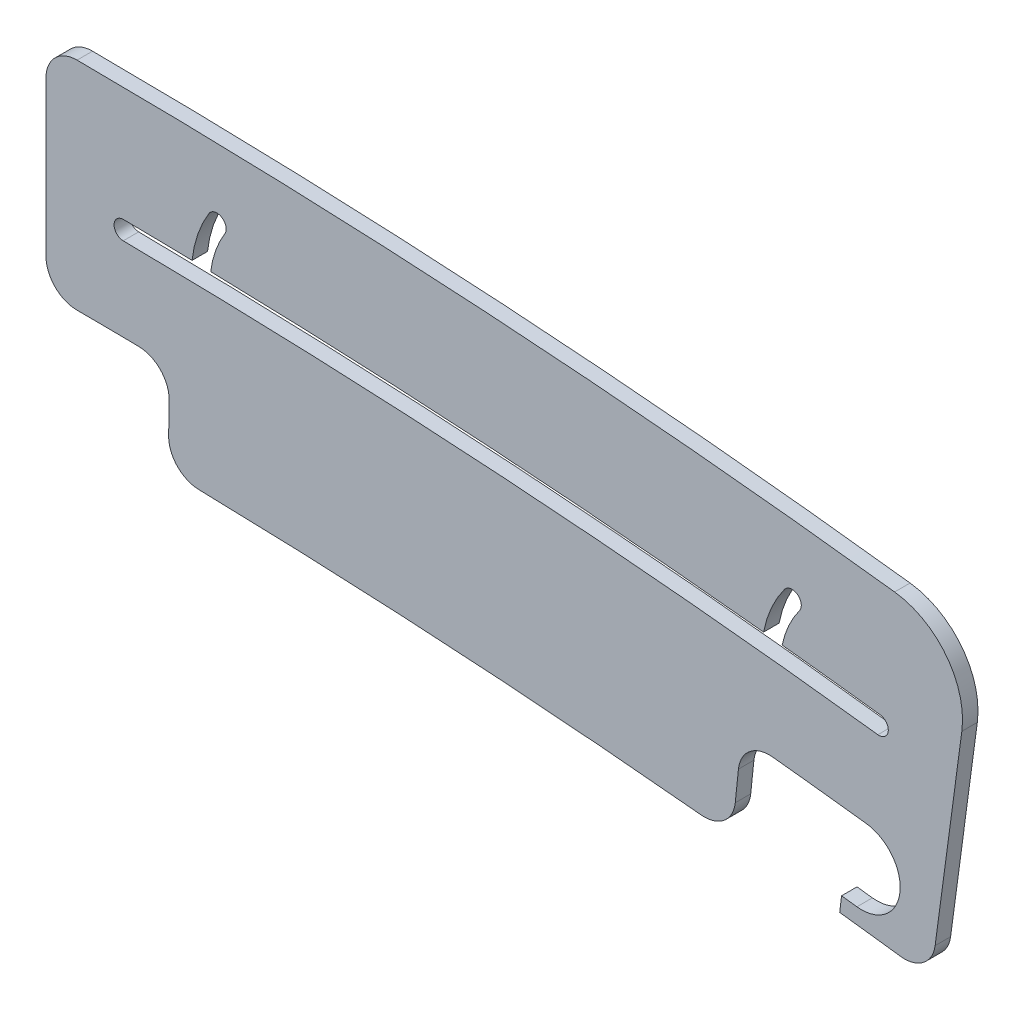
ISO-10303-21;
HEADER;
FILE_DESCRIPTION(('STEP AP214'),'2;1');
FILE_NAME('part.step','',(''),(''),'','','');
FILE_SCHEMA(('AUTOMOTIVE_DESIGN { 1 0 10303 214 1 1 1 1 }'));
ENDSEC;
DATA;
#1=APPLICATION_CONTEXT('core data for automotive mechanical design processes');
#2=APPLICATION_PROTOCOL_DEFINITION('international standard','automotive_design',2000,#1);
#3=PRODUCT_CONTEXT('',#1,'mechanical');
#4=PRODUCT('Part','Part','',(#3));
#5=PRODUCT_RELATED_PRODUCT_CATEGORY('part','',(#4));
#6=PRODUCT_DEFINITION_FORMATION('','',#4);
#7=PRODUCT_DEFINITION_CONTEXT('part definition',#1,'design');
#8=PRODUCT_DEFINITION('design','',#6,#7);
#9=PRODUCT_DEFINITION_SHAPE('','',#8);
#10=(LENGTH_UNIT() NAMED_UNIT(*) SI_UNIT(.MILLI.,.METRE.));
#11=(NAMED_UNIT(*) PLANE_ANGLE_UNIT() SI_UNIT($,.RADIAN.));
#12=(NAMED_UNIT(*) SI_UNIT($,.STERADIAN.) SOLID_ANGLE_UNIT());
#13=UNCERTAINTY_MEASURE_WITH_UNIT(LENGTH_MEASURE(1.E-05),#10,'distance_accuracy_value','');
#14=(GEOMETRIC_REPRESENTATION_CONTEXT(3) GLOBAL_UNCERTAINTY_ASSIGNED_CONTEXT((#13)) GLOBAL_UNIT_ASSIGNED_CONTEXT((#10,
#11,#12)) REPRESENTATION_CONTEXT('',''));
#15=CARTESIAN_POINT('',(0.,0.,0.));
#16=DIRECTION('',(0.,0.,1.));
#17=DIRECTION('',(1.,0.,0.));
#18=AXIS2_PLACEMENT_3D('',#15,#16,#17);
#19=CARTESIAN_POINT('',(0.,-450.,1.));
#20=DIRECTION('',(0.,0.,-1.));
#21=DIRECTION('',(-1.,0.,0.));
#22=AXIS2_PLACEMENT_3D('',#19,#20,#21);
#23=PLANE('',#22);
#24=DIRECTION('',(0.133036707085296,0.991111111111111,0.));
#25=VECTOR('',#24,1.);
#26=CARTESIAN_POINT('',(59.8665181883831,-4.,1.));
#27=LINE('',#26,#25);
#28=CARTESIAN_POINT('',(57.4712415468665,-21.8445885019532,1.));
#29=VERTEX_POINT('',#28);
#30=CARTESIAN_POINT('',(59.1975975488495,-8.98339663404445,1.));
#31=VERTEX_POINT('',#30);
#32=EDGE_CURVE('E371',#29,#31,#27,.T.);
#33=ORIENTED_EDGE('',*,*,#32,.T.);
#34=CARTESIAN_POINT('',(54.242041993294,-8.31821309861797,1.));
#35=DIRECTION('',(0.,0.,-1.));
#36=DIRECTION('',(-1.,0.,0.));
#37=AXIS2_PLACEMENT_3D('',#34,#35,#36);
#38=CIRCLE('',#37,5.);
#39=CARTESIAN_POINT('',(54.851503139286,-3.355496391861,1.));
#40=VERTEX_POINT('',#39);
#41=EDGE_CURVE('E438',#31,#40,#38,.F.);
#42=ORIENTED_EDGE('',*,*,#41,.T.);
#43=CARTESIAN_POINT('',(0.,-450.,1.));
#44=DIRECTION('',(0.,0.,1.));
#45=DIRECTION('',(-1.,0.,0.));
#46=AXIS2_PLACEMENT_3D('',#43,#44,#45);
#47=CIRCLE('',#46,450.);
#48=CARTESIAN_POINT('',(2.00892857142857,-0.00448423790389008,1.));
#49=VERTEX_POINT('',#48);
#50=EDGE_CURVE('E360',#40,#49,#47,.T.);
#51=ORIENTED_EDGE('',*,*,#50,.T.);
#52=CARTESIAN_POINT('',(2.,-2.00446430795764,1.));
#53=DIRECTION('',(0.,0.,-1.));
#54=DIRECTION('',(-1.,0.,0.));
#55=AXIS2_PLACEMENT_3D('',#52,#53,#54);
#56=CIRCLE('',#55,2.);
#57=CARTESIAN_POINT('',(0.,-2.00446430795764,1.));
#58=VERTEX_POINT('',#57);
#59=EDGE_CURVE('E428',#49,#58,#56,.F.);
#60=ORIENTED_EDGE('',*,*,#59,.T.);
#61=DIRECTION('',(0.,-1.,0.));
#62=VECTOR('',#61,1.);
#63=CARTESIAN_POINT('',(0.,0.,1.));
#64=LINE('',#63,#62);
#65=CARTESIAN_POINT('',(0.,-12.0045662338476,1.));
#66=VERTEX_POINT('',#65);
#67=EDGE_CURVE('E363',#58,#66,#64,.T.);
#68=ORIENTED_EDGE('',*,*,#67,.T.);
#69=CARTESIAN_POINT('',(2.,-12.0045662338476,1.));
#70=DIRECTION('',(0.,0.,-1.));
#71=DIRECTION('',(-1.,0.,0.));
#72=AXIS2_PLACEMENT_3D('',#69,#70,#71);
#73=CIRCLE('',#72,2.);
#74=CARTESIAN_POINT('',(1.99086757990868,-14.0045453834647,1.));
#75=VERTEX_POINT('',#74);
#76=EDGE_CURVE('E434',#66,#75,#73,.F.);
#77=ORIENTED_EDGE('',*,*,#76,.T.);
#78=CARTESIAN_POINT('',(0.,-450.,1.));
#79=DIRECTION('',(0.,0.,-1.));
#80=DIRECTION('',(-1.,0.,0.));
#81=AXIS2_PLACEMENT_3D('',#78,#79,#80);
#82=CIRCLE('',#81,436.);
#83=CARTESIAN_POINT('',(5.99103671611213,-14.0411630909792,1.));
#84=VERTEX_POINT('',#83);
#85=EDGE_CURVE('E321',#75,#84,#82,.T.);
#86=ORIENTED_EDGE('',*,*,#85,.T.);
#87=CARTESIAN_POINT('',(5.96355489631345,-16.0409742694609,1.));
#88=DIRECTION('',(0.,0.,-1.));
#89=DIRECTION('',(-1.,0.,0.));
#90=AXIS2_PLACEMENT_3D('',#87,#88,#89);
#91=CIRCLE('',#90,2.);
#92=CARTESIAN_POINT('',(7.96321819597437,-16.0776715171673,1.));
#93=VERTEX_POINT('',#92);
#94=EDGE_CURVE('E476',#84,#93,#91,.T.);
#95=ORIENTED_EDGE('',*,*,#94,.T.);
#96=DIRECTION('',(-0.0183486238532108,-0.999831649830457,0.));
#97=VECTOR('',#96,1.);
#98=CARTESIAN_POINT('',(1.05800317534116E-13,-450.,1.));
#99=LINE('',#98,#97);
#100=CARTESIAN_POINT('',(7.92652055679932,-18.0773561482767,1.));
#101=VERTEX_POINT('',#100);
#102=EDGE_CURVE('E318',#93,#101,#99,.T.);
#103=ORIENTED_EDGE('',*,*,#102,.T.);
#104=CARTESIAN_POINT('',(9.92618385646023,-18.1140533959831,1.));
#105=DIRECTION('',(0.,0.,-1.));
#106=DIRECTION('',(-1.,0.,0.));
#107=AXIS2_PLACEMENT_3D('',#104,#105,#106);
#108=CIRCLE('',#107,2.);
#109=CARTESIAN_POINT('',(9.88022930156921,-20.1135253710017,1.));
#110=VERTEX_POINT('',#109);
#111=EDGE_CURVE('E436',#101,#110,#108,.F.);
#112=ORIENTED_EDGE('',*,*,#111,.T.);
#113=CARTESIAN_POINT('',(0.,-450.,1.));
#114=DIRECTION('',(0.,0.,-1.));
#115=DIRECTION('',(-1.,0.,0.));
#116=AXIS2_PLACEMENT_3D('',#113,#114,#115);
#117=CIRCLE('',#116,430.);
#118=CARTESIAN_POINT('',(42.3645730173292,-22.0920157872029,1.));
#119=VERTEX_POINT('',#118);
#120=EDGE_CURVE('E368',#110,#119,#117,.T.);
#121=ORIENTED_EDGE('',*,*,#120,.T.);
#122=CARTESIAN_POINT('',(42.5616175429912,-20.1017460931899,1.));
#123=DIRECTION('',(0.,0.,-1.));
#124=DIRECTION('',(-1.,0.,0.));
#125=AXIS2_PLACEMENT_3D('',#122,#123,#124);
#126=CIRCLE('',#125,2.);
#127=CARTESIAN_POINT('',(44.5509536645222,-20.308002718713,1.));
#128=VERTEX_POINT('',#127);
#129=EDGE_CURVE('E432',#119,#128,#126,.F.);
#130=ORIENTED_EDGE('',*,*,#129,.T.);
#131=DIRECTION('',(-0.103128312761512,-0.994668060765482,0.));
#132=VECTOR('',#131,1.);
#133=CARTESIAN_POINT('',(0.,-450.,1.));
#134=LINE('',#133,#132);
#135=CARTESIAN_POINT('',(44.7572124902919,-18.318645375899,1.));
#136=VERTEX_POINT('',#135);
#137=EDGE_CURVE('E306',#136,#128,#134,.T.);
#138=ORIENTED_EDGE('',*,*,#137,.F.);
#139=CARTESIAN_POINT('',(46.7465486118228,-18.524902001422,1.));
#140=DIRECTION('',(0.,0.,-1.));
#141=DIRECTION('',(-1.,0.,0.));
#142=AXIS2_PLACEMENT_3D('',#139,#140,#141);
#143=CIRCLE('',#142,2.);
#144=CARTESIAN_POINT('',(46.9619704948266,-16.5365374945161,1.));
#145=VERTEX_POINT('',#144);
#146=EDGE_CURVE('E472',#136,#145,#143,.T.);
#147=ORIENTED_EDGE('',*,*,#146,.T.);
#148=CARTESIAN_POINT('',(0.,-450.,1.));
#149=DIRECTION('',(0.,0.,-1.));
#150=DIRECTION('',(-1.,0.,0.));
#151=AXIS2_PLACEMENT_3D('',#148,#149,#150);
#152=CIRCLE('',#151,436.);
#153=CARTESIAN_POINT('',(52.9404385732173,-17.2260290132094,1.));
#154=VERTEX_POINT('',#153);
#155=EDGE_CURVE('E309',#154,#145,#152,.F.);
#156=ORIENTED_EDGE('',*,*,#155,.F.);
#157=CARTESIAN_POINT('',(52.712174171319,-19.715586275621,1.));
#158=DIRECTION('',(0.,0.,-1.));
#159=DIRECTION('',(-1.,0.,0.));
#160=AXIS2_PLACEMENT_3D('',#157,#158,#159);
#161=CIRCLE('',#160,2.50000000000002);
#162=CARTESIAN_POINT('',(52.4139082158087,-22.1977299901919,1.));
#163=VERTEX_POINT('',#162);
#164=EDGE_CURVE('E312',#163,#154,#161,.F.);
#165=ORIENTED_EDGE('',*,*,#164,.F.);
#166=DIRECTION('',(0.992857485828335,-0.11930638220413,0.));
#167=VECTOR('',#166,1.);
#168=CARTESIAN_POINT('',(51.4210507299799,-22.0784236079877,1.));
#169=LINE('',#168,#167);
#170=CARTESIAN_POINT('',(51.4210507299804,-22.0784236079877,1.));
#171=VERTEX_POINT('',#170);
#172=EDGE_CURVE('E314',#171,#163,#169,.T.);
#173=ORIENTED_EDGE('',*,*,#172,.F.);
#174=DIRECTION('',(0.119306382204129,0.992857485828335,0.));
#175=VECTOR('',#174,1.);
#176=CARTESIAN_POINT('',(8.12941265191821E-13,-450.,1.));
#177=LINE('',#176,#175);
#178=CARTESIAN_POINT('',(51.3017443477763,-23.0712810938161,1.));
#179=VERTEX_POINT('',#178);
#180=EDGE_CURVE('E316',#179,#171,#177,.T.);
#181=ORIENTED_EDGE('',*,*,#180,.F.);
#182=CARTESIAN_POINT('',(55.2321257166598,-23.5619478883022,1.));
#183=VERTEX_POINT('',#182);
#184=EDGE_CURVE('E367',#179,#183,#117,.T.);
#185=ORIENTED_EDGE('',*,*,#184,.T.);
#186=CARTESIAN_POINT('',(55.4890193246442,-21.5785150877826,1.));
#187=DIRECTION('',(0.,0.,-1.));
#188=DIRECTION('',(-1.,0.,0.));
#189=AXIS2_PLACEMENT_3D('',#186,#187,#188);
#190=CIRCLE('',#189,2.);
#191=EDGE_CURVE('E430',#183,#29,#190,.F.);
#192=ORIENTED_EDGE('',*,*,#191,.T.);
#193=EDGE_LOOP('',(#33,#42,#51,#60,#68,#77,#86,#95,#103,#112,#121,#130,#138,#147,#156,#165,#173,
#181,#185,#192));
#194=FACE_BOUND('',#193,.T.);
#195=CARTESIAN_POINT('',(16.9962838551157,-8.32690105110958,1.));
#196=DIRECTION('',(0.,0.,1.));
#197=DIRECTION('',(1.,0.,0.));
#198=AXIS2_PLACEMENT_3D('',#195,#196,#197);
#199=CIRCLE('',#198,7.59999999999989);
#200=CARTESIAN_POINT('',(10.5336098122508,-4.327670598175,1.));
#201=VERTEX_POINT('',#200);
#202=CARTESIAN_POINT('',(9.44132463384758,-7.50071029530662,1.));
#203=VERTEX_POINT('',#202);
#204=EDGE_CURVE('E254',#201,#203,#199,.T.);
#205=ORIENTED_EDGE('',*,*,#204,.F.);
#206=CARTESIAN_POINT('',(11.043820920898,-4.64339931814346,1.));
#207=DIRECTION('',(0.,0.,1.));
#208=DIRECTION('',(1.,0.,0.));
#209=AXIS2_PLACEMENT_3D('',#206,#207,#208);
#210=CIRCLE('',#209,0.599999999999878);
#211=CARTESIAN_POINT('',(11.5540320295451,-4.95912803811192,1.));
#212=VERTEX_POINT('',#211);
#213=EDGE_CURVE('E244',#212,#201,#210,.T.);
#214=ORIENTED_EDGE('',*,*,#213,.F.);
#215=CARTESIAN_POINT('',(16.9962838551157,-8.32690105110958,1.));
#216=DIRECTION('',(0.,0.,-1.));
#217=DIRECTION('',(1.,0.,0.));
#218=AXIS2_PLACEMENT_3D('',#215,#216,#217);
#219=CIRCLE('',#218,6.40000000000013);
#220=CARTESIAN_POINT('',(10.6463344999857,-7.52806240201598,1.));
#221=VERTEX_POINT('',#220);
#222=EDGE_CURVE('E266',#221,#212,#219,.T.);
#223=ORIENTED_EDGE('',*,*,#222,.F.);
#224=CARTESIAN_POINT('',(0.,-450.,1.));
#225=DIRECTION('',(0.,0.,1.));
#226=DIRECTION('',(-1.,0.,0.));
#227=AXIS2_PLACEMENT_3D('',#224,#225,#226);
#228=CIRCLE('',#227,442.6);
#229=CARTESIAN_POINT('',(46.3834845654295,-9.8371524542667,1.));
#230=VERTEX_POINT('',#229);
#231=EDGE_CURVE('E342',#230,#221,#228,.T.);
#232=ORIENTED_EDGE('',*,*,#231,.F.);
#233=CARTESIAN_POINT('',(53.8429858944531,-11.2917451540606,1.));
#234=DIRECTION('',(0.,0.,1.));
#235=DIRECTION('',(1.,0.,0.));
#236=AXIS2_PLACEMENT_3D('',#233,#234,#235);
#237=CIRCLE('',#236,7.59999999999992);
#238=CARTESIAN_POINT('',(47.7370885115114,-6.76648083592575,1.));
#239=VERTEX_POINT('',#238);
#240=EDGE_CURVE('E58',#239,#230,#237,.T.);
#241=ORIENTED_EDGE('',*,*,#240,.F.);
#242=CARTESIAN_POINT('',(48.2191330417436,-7.12373854525214,1.));
#243=DIRECTION('',(0.,0.,1.));
#244=DIRECTION('',(1.,0.,0.));
#245=AXIS2_PLACEMENT_3D('',#242,#243,#244);
#246=CIRCLE('',#245,0.599999999999923);
#247=CARTESIAN_POINT('',(48.7011775719758,-7.48099625457854,1.));
#248=VERTEX_POINT('',#247);
#249=EDGE_CURVE('E261',#248,#239,#246,.T.);
#250=ORIENTED_EDGE('',*,*,#249,.F.);
#251=CARTESIAN_POINT('',(53.8429858944531,-11.2917451540606,1.));
#252=DIRECTION('',(0.,0.,-1.));
#253=DIRECTION('',(1.,0.,0.));
#254=AXIS2_PLACEMENT_3D('',#251,#252,#253);
#255=CIRCLE('',#254,6.40000000000007);
#256=CARTESIAN_POINT('',(47.581994684171,-9.96509935929468,1.));
#257=VERTEX_POINT('',#256);
#258=EDGE_CURVE('E279',#257,#248,#255,.T.);
#259=ORIENTED_EDGE('',*,*,#258,.F.);
#260=CARTESIAN_POINT('',(53.9160759205542,-10.6962135863965,1.));
#261=VERTEX_POINT('',#260);
#262=EDGE_CURVE('E338',#261,#257,#228,.T.);
#263=ORIENTED_EDGE('',*,*,#262,.F.);
#264=CARTESIAN_POINT('',(53.8429858944531,-11.2917451540606,1.));
#265=DIRECTION('',(0.,0.,1.));
#266=DIRECTION('',(1.,0.,0.));
#267=AXIS2_PLACEMENT_3D('',#264,#265,#266);
#268=CIRCLE('',#267,0.599999999999949);
#269=CARTESIAN_POINT('',(53.7698958683521,-11.8872767217247,1.));
#270=VERTEX_POINT('',#269);
#271=EDGE_CURVE('E347',#270,#261,#268,.T.);
#272=ORIENTED_EDGE('',*,*,#271,.F.);
#273=CARTESIAN_POINT('',(0.,-450.,1.));
#274=DIRECTION('',(0.,0.,-1.));
#275=DIRECTION('',(-1.,0.,0.));
#276=AXIS2_PLACEMENT_3D('',#273,#274,#275);
#277=CIRCLE('',#276,441.4);
#278=CARTESIAN_POINT('',(4.99321266968326,-8.62824305667746,1.));
#279=VERTEX_POINT('',#278);
#280=EDGE_CURVE('E345',#279,#270,#277,.T.);
#281=ORIENTED_EDGE('',*,*,#280,.F.);
#282=CARTESIAN_POINT('',(5.,-8.02828144778312,1.));
#283=DIRECTION('',(0.,0.,1.));
#284=DIRECTION('',(1.,0.,0.));
#285=AXIS2_PLACEMENT_3D('',#282,#283,#284);
#286=CIRCLE('',#285,0.599999999999937);
#287=CARTESIAN_POINT('',(5.00678733031674,-7.42831983888876,1.));
#288=VERTEX_POINT('',#287);
#289=EDGE_CURVE('E341',#288,#279,#286,.T.);
#290=ORIENTED_EDGE('',*,*,#289,.F.);
#291=EDGE_CURVE('E265',#203,#288,#228,.T.);
#292=ORIENTED_EDGE('',*,*,#291,.F.);
#293=EDGE_LOOP('',(#205,#214,#223,#232,#241,#250,#259,#263,#272,#281,#290,#292));
#294=FACE_BOUND('',#293,.T.);
#295=ADVANCED_FACE('F35',(#194,#294),#23,.F.);
#296=CARTESIAN_POINT('',(0.,-450.,0.));
#297=DIRECTION('',(0.,0.,-1.));
#298=DIRECTION('',(-1.,0.,0.));
#299=AXIS2_PLACEMENT_3D('',#296,#297,#298);
#300=PLANE('',#299);
#301=CARTESIAN_POINT('',(0.,-450.,0.));
#302=DIRECTION('',(0.,0.,1.));
#303=DIRECTION('',(-1.,0.,0.));
#304=AXIS2_PLACEMENT_3D('',#301,#302,#303);
#305=CIRCLE('',#304,450.);
#306=CARTESIAN_POINT('',(54.851503139286,-3.355496391861,0.));
#307=VERTEX_POINT('',#306);
#308=CARTESIAN_POINT('',(2.00892857142857,-0.00448423790389008,0.));
#309=VERTEX_POINT('',#308);
#310=EDGE_CURVE('E352',#307,#309,#305,.T.);
#311=ORIENTED_EDGE('',*,*,#310,.F.);
#312=CARTESIAN_POINT('',(54.242041993294,-8.31821309861797,0.));
#313=DIRECTION('',(0.,0.,-1.));
#314=DIRECTION('',(-1.,0.,0.));
#315=AXIS2_PLACEMENT_3D('',#312,#313,#314);
#316=CIRCLE('',#315,5.);
#317=CARTESIAN_POINT('',(59.1975975488495,-8.98339663404445,0.));
#318=VERTEX_POINT('',#317);
#319=EDGE_CURVE('E421',#307,#318,#316,.T.);
#320=ORIENTED_EDGE('',*,*,#319,.T.);
#321=DIRECTION('',(0.133036707085296,0.991111111111111,0.));
#322=VECTOR('',#321,1.);
#323=CARTESIAN_POINT('',(59.8665181883831,-4.,0.));
#324=LINE('',#323,#322);
#325=CARTESIAN_POINT('',(57.4712415468665,-21.8445885019532,0.));
#326=VERTEX_POINT('',#325);
#327=EDGE_CURVE('E364',#326,#318,#324,.T.);
#328=ORIENTED_EDGE('',*,*,#327,.F.);
#329=CARTESIAN_POINT('',(55.4890193246442,-21.5785150877826,0.));
#330=DIRECTION('',(0.,0.,-1.));
#331=DIRECTION('',(-1.,0.,0.));
#332=AXIS2_PLACEMENT_3D('',#329,#330,#331);
#333=CIRCLE('',#332,2.);
#334=CARTESIAN_POINT('',(55.2321257166598,-23.5619478883022,0.));
#335=VERTEX_POINT('',#334);
#336=EDGE_CURVE('E413',#326,#335,#333,.T.);
#337=ORIENTED_EDGE('',*,*,#336,.T.);
#338=CARTESIAN_POINT('',(0.,-450.,0.));
#339=DIRECTION('',(0.,0.,-1.));
#340=DIRECTION('',(-1.,0.,0.));
#341=AXIS2_PLACEMENT_3D('',#338,#339,#340);
#342=CIRCLE('',#341,430.);
#343=CARTESIAN_POINT('',(51.3017443477763,-23.0712810938161,0.));
#344=VERTEX_POINT('',#343);
#345=EDGE_CURVE('E380',#344,#335,#342,.T.);
#346=ORIENTED_EDGE('',*,*,#345,.F.);
#347=DIRECTION('',(0.119306382204129,0.992857485828335,0.));
#348=VECTOR('',#347,1.);
#349=CARTESIAN_POINT('',(8.12941265191821E-13,-450.,0.));
#350=LINE('',#349,#348);
#351=CARTESIAN_POINT('',(51.4210507299804,-22.0784236079877,0.));
#352=VERTEX_POINT('',#351);
#353=EDGE_CURVE('E403',#344,#352,#350,.T.);
#354=ORIENTED_EDGE('',*,*,#353,.T.);
#355=DIRECTION('',(0.992857485828335,-0.11930638220413,0.));
#356=VECTOR('',#355,1.);
#357=CARTESIAN_POINT('',(51.4210507299799,-22.0784236079877,0.));
#358=LINE('',#357,#356);
#359=CARTESIAN_POINT('',(52.4139082158087,-22.1977299901919,0.));
#360=VERTEX_POINT('',#359);
#361=EDGE_CURVE('E400',#352,#360,#358,.T.);
#362=ORIENTED_EDGE('',*,*,#361,.T.);
#363=CARTESIAN_POINT('',(52.712174171319,-19.715586275621,0.));
#364=DIRECTION('',(0.,0.,-1.));
#365=DIRECTION('',(-1.,0.,0.));
#366=AXIS2_PLACEMENT_3D('',#363,#364,#365);
#367=CIRCLE('',#366,2.50000000000002);
#368=CARTESIAN_POINT('',(52.9404385732173,-17.2260290132094,0.));
#369=VERTEX_POINT('',#368);
#370=EDGE_CURVE('E397',#360,#369,#367,.F.);
#371=ORIENTED_EDGE('',*,*,#370,.T.);
#372=CARTESIAN_POINT('',(0.,-450.,0.));
#373=DIRECTION('',(0.,0.,-1.));
#374=DIRECTION('',(-1.,0.,0.));
#375=AXIS2_PLACEMENT_3D('',#372,#373,#374);
#376=CIRCLE('',#375,436.);
#377=CARTESIAN_POINT('',(46.9619704948266,-16.5365374945161,0.));
#378=VERTEX_POINT('',#377);
#379=EDGE_CURVE('E394',#369,#378,#376,.F.);
#380=ORIENTED_EDGE('',*,*,#379,.T.);
#381=CARTESIAN_POINT('',(46.7465486118228,-18.524902001422,0.));
#382=DIRECTION('',(0.,0.,-1.));
#383=DIRECTION('',(-1.,0.,0.));
#384=AXIS2_PLACEMENT_3D('',#381,#382,#383);
#385=CIRCLE('',#384,2.);
#386=CARTESIAN_POINT('',(44.7572124902919,-18.318645375899,0.));
#387=VERTEX_POINT('',#386);
#388=EDGE_CURVE('E470',#378,#387,#385,.F.);
#389=ORIENTED_EDGE('',*,*,#388,.T.);
#390=DIRECTION('',(-0.103128312761512,-0.994668060765482,0.));
#391=VECTOR('',#390,1.);
#392=CARTESIAN_POINT('',(0.,-450.,0.));
#393=LINE('',#392,#391);
#394=CARTESIAN_POINT('',(44.5509536645222,-20.308002718713,0.));
#395=VERTEX_POINT('',#394);
#396=EDGE_CURVE('E391',#387,#395,#393,.T.);
#397=ORIENTED_EDGE('',*,*,#396,.T.);
#398=CARTESIAN_POINT('',(42.5616175429912,-20.1017460931899,0.));
#399=DIRECTION('',(0.,0.,-1.));
#400=DIRECTION('',(-1.,0.,0.));
#401=AXIS2_PLACEMENT_3D('',#398,#399,#400);
#402=CIRCLE('',#401,2.);
#403=CARTESIAN_POINT('',(42.3645730173292,-22.0920157872029,0.));
#404=VERTEX_POINT('',#403);
#405=EDGE_CURVE('E415',#395,#404,#402,.T.);
#406=ORIENTED_EDGE('',*,*,#405,.T.);
#407=CARTESIAN_POINT('',(9.88022930156921,-20.1135253710017,0.));
#408=VERTEX_POINT('',#407);
#409=EDGE_CURVE('E381',#408,#404,#342,.T.);
#410=ORIENTED_EDGE('',*,*,#409,.F.);
#411=CARTESIAN_POINT('',(9.92618385646023,-18.1140533959831,0.));
#412=DIRECTION('',(0.,0.,-1.));
#413=DIRECTION('',(-1.,0.,0.));
#414=AXIS2_PLACEMENT_3D('',#411,#412,#413);
#415=CIRCLE('',#414,2.);
#416=CARTESIAN_POINT('',(7.92652055679932,-18.0773561482767,0.));
#417=VERTEX_POINT('',#416);
#418=EDGE_CURVE('E419',#408,#417,#415,.T.);
#419=ORIENTED_EDGE('',*,*,#418,.T.);
#420=DIRECTION('',(-0.0183486238532108,-0.999831649830457,0.));
#421=VECTOR('',#420,1.);
#422=CARTESIAN_POINT('',(1.05800317534116E-13,-450.,0.));
#423=LINE('',#422,#421);
#424=CARTESIAN_POINT('',(7.96321819597437,-16.0776715171673,0.));
#425=VERTEX_POINT('',#424);
#426=EDGE_CURVE('E374',#425,#417,#423,.T.);
#427=ORIENTED_EDGE('',*,*,#426,.F.);
#428=CARTESIAN_POINT('',(5.96355489631345,-16.0409742694609,0.));
#429=DIRECTION('',(0.,0.,-1.));
#430=DIRECTION('',(-1.,0.,0.));
#431=AXIS2_PLACEMENT_3D('',#428,#429,#430);
#432=CIRCLE('',#431,2.);
#433=CARTESIAN_POINT('',(5.99103671611213,-14.0411630909792,0.));
#434=VERTEX_POINT('',#433);
#435=EDGE_CURVE('E474',#425,#434,#432,.F.);
#436=ORIENTED_EDGE('',*,*,#435,.T.);
#437=CARTESIAN_POINT('',(0.,-450.,0.));
#438=DIRECTION('',(0.,0.,-1.));
#439=DIRECTION('',(-1.,0.,0.));
#440=AXIS2_PLACEMENT_3D('',#437,#438,#439);
#441=CIRCLE('',#440,436.);
#442=CARTESIAN_POINT('',(1.99086757990868,-14.0045453834647,0.));
#443=VERTEX_POINT('',#442);
#444=EDGE_CURVE('E388',#443,#434,#441,.T.);
#445=ORIENTED_EDGE('',*,*,#444,.F.);
#446=CARTESIAN_POINT('',(2.,-12.0045662338476,0.));
#447=DIRECTION('',(0.,0.,-1.));
#448=DIRECTION('',(-1.,0.,0.));
#449=AXIS2_PLACEMENT_3D('',#446,#447,#448);
#450=CIRCLE('',#449,2.);
#451=CARTESIAN_POINT('',(0.,-12.0045662338476,0.));
#452=VERTEX_POINT('',#451);
#453=EDGE_CURVE('E417',#443,#452,#450,.T.);
#454=ORIENTED_EDGE('',*,*,#453,.T.);
#455=DIRECTION('',(0.,-1.,0.));
#456=VECTOR('',#455,1.);
#457=CARTESIAN_POINT('',(0.,0.,0.));
#458=LINE('',#457,#456);
#459=CARTESIAN_POINT('',(0.,-2.00446430795764,0.));
#460=VERTEX_POINT('',#459);
#461=EDGE_CURVE('E377',#460,#452,#458,.T.);
#462=ORIENTED_EDGE('',*,*,#461,.F.);
#463=CARTESIAN_POINT('',(2.,-2.00446430795764,0.));
#464=DIRECTION('',(0.,0.,-1.));
#465=DIRECTION('',(-1.,0.,0.));
#466=AXIS2_PLACEMENT_3D('',#463,#464,#465);
#467=CIRCLE('',#466,2.);
#468=EDGE_CURVE('E411',#460,#309,#467,.T.);
#469=ORIENTED_EDGE('',*,*,#468,.T.);
#470=EDGE_LOOP('',(#311,#320,#328,#337,#346,#354,#362,#371,#380,#389,#397,#406,#410,#419,#427,
#436,#445,#454,#462,#469));
#471=FACE_BOUND('',#470,.T.);
#472=CARTESIAN_POINT('',(11.043820920898,-4.64339931814346,0.));
#473=DIRECTION('',(0.,0.,1.));
#474=DIRECTION('',(1.,0.,0.));
#475=AXIS2_PLACEMENT_3D('',#472,#473,#474);
#476=CIRCLE('',#475,0.599999999999878);
#477=CARTESIAN_POINT('',(11.5540320295451,-4.95912803811192,0.));
#478=VERTEX_POINT('',#477);
#479=CARTESIAN_POINT('',(10.5336098122508,-4.327670598175,0.));
#480=VERTEX_POINT('',#479);
#481=EDGE_CURVE('E270',#478,#480,#476,.T.);
#482=ORIENTED_EDGE('',*,*,#481,.T.);
#483=CARTESIAN_POINT('',(16.9962838551157,-8.32690105110958,0.));
#484=DIRECTION('',(0.,0.,1.));
#485=DIRECTION('',(1.,0.,0.));
#486=AXIS2_PLACEMENT_3D('',#483,#484,#485);
#487=CIRCLE('',#486,7.59999999999989);
#488=CARTESIAN_POINT('',(9.44132463384758,-7.50071029530662,0.));
#489=VERTEX_POINT('',#488);
#490=EDGE_CURVE('E260',#480,#489,#487,.T.);
#491=ORIENTED_EDGE('',*,*,#490,.T.);
#492=CARTESIAN_POINT('',(0.,-450.,0.));
#493=DIRECTION('',(0.,0.,1.));
#494=DIRECTION('',(-1.,0.,0.));
#495=AXIS2_PLACEMENT_3D('',#492,#493,#494);
#496=CIRCLE('',#495,442.6);
#497=CARTESIAN_POINT('',(5.00678733031674,-7.42831983888876,0.));
#498=VERTEX_POINT('',#497);
#499=EDGE_CURVE('E329',#489,#498,#496,.T.);
#500=ORIENTED_EDGE('',*,*,#499,.T.);
#501=CARTESIAN_POINT('',(5.,-8.02828144778312,0.));
#502=DIRECTION('',(0.,0.,1.));
#503=DIRECTION('',(1.,0.,0.));
#504=AXIS2_PLACEMENT_3D('',#501,#502,#503);
#505=CIRCLE('',#504,0.599999999999937);
#506=CARTESIAN_POINT('',(4.99321266968326,-8.62824305667746,0.));
#507=VERTEX_POINT('',#506);
#508=EDGE_CURVE('E327',#498,#507,#505,.T.);
#509=ORIENTED_EDGE('',*,*,#508,.T.);
#510=CARTESIAN_POINT('',(0.,-450.,0.));
#511=DIRECTION('',(0.,0.,-1.));
#512=DIRECTION('',(-1.,0.,0.));
#513=AXIS2_PLACEMENT_3D('',#510,#511,#512);
#514=CIRCLE('',#513,441.4);
#515=CARTESIAN_POINT('',(53.7698958683521,-11.8872767217247,0.));
#516=VERTEX_POINT('',#515);
#517=EDGE_CURVE('E332',#507,#516,#514,.T.);
#518=ORIENTED_EDGE('',*,*,#517,.T.);
#519=CARTESIAN_POINT('',(53.8429858944531,-11.2917451540606,0.));
#520=DIRECTION('',(0.,0.,1.));
#521=DIRECTION('',(1.,0.,0.));
#522=AXIS2_PLACEMENT_3D('',#519,#520,#521);
#523=CIRCLE('',#522,0.599999999999949);
#524=CARTESIAN_POINT('',(53.9160759205542,-10.6962135863965,0.));
#525=VERTEX_POINT('',#524);
#526=EDGE_CURVE('E334',#516,#525,#523,.T.);
#527=ORIENTED_EDGE('',*,*,#526,.T.);
#528=CARTESIAN_POINT('',(47.581994684171,-9.96509935929468,0.));
#529=VERTEX_POINT('',#528);
#530=EDGE_CURVE('E324',#525,#529,#496,.T.);
#531=ORIENTED_EDGE('',*,*,#530,.T.);
#532=CARTESIAN_POINT('',(53.8429858944531,-11.2917451540606,0.));
#533=DIRECTION('',(0.,0.,-1.));
#534=DIRECTION('',(1.,0.,0.));
#535=AXIS2_PLACEMENT_3D('',#532,#533,#534);
#536=CIRCLE('',#535,6.40000000000007);
#537=CARTESIAN_POINT('',(48.7011775719758,-7.48099625457854,0.));
#538=VERTEX_POINT('',#537);
#539=EDGE_CURVE('E282',#529,#538,#536,.T.);
#540=ORIENTED_EDGE('',*,*,#539,.T.);
#541=CARTESIAN_POINT('',(48.2191330417436,-7.12373854525214,0.));
#542=DIRECTION('',(0.,0.,1.));
#543=DIRECTION('',(1.,0.,0.));
#544=AXIS2_PLACEMENT_3D('',#541,#542,#543);
#545=CIRCLE('',#544,0.599999999999923);
#546=CARTESIAN_POINT('',(47.7370885115114,-6.76648083592575,0.));
#547=VERTEX_POINT('',#546);
#548=EDGE_CURVE('E275',#538,#547,#545,.T.);
#549=ORIENTED_EDGE('',*,*,#548,.T.);
#550=CARTESIAN_POINT('',(53.8429858944531,-11.2917451540606,0.));
#551=DIRECTION('',(0.,0.,1.));
#552=DIRECTION('',(1.,0.,0.));
#553=AXIS2_PLACEMENT_3D('',#550,#551,#552);
#554=CIRCLE('',#553,7.59999999999992);
#555=CARTESIAN_POINT('',(46.3834845654295,-9.83715245426671,0.));
#556=VERTEX_POINT('',#555);
#557=EDGE_CURVE('E278',#547,#556,#554,.T.);
#558=ORIENTED_EDGE('',*,*,#557,.T.);
#559=CARTESIAN_POINT('',(10.6463344999857,-7.52806240201598,0.));
#560=VERTEX_POINT('',#559);
#561=EDGE_CURVE('E328',#556,#560,#496,.T.);
#562=ORIENTED_EDGE('',*,*,#561,.T.);
#563=CARTESIAN_POINT('',(16.9962838551157,-8.32690105110958,0.));
#564=DIRECTION('',(0.,0.,-1.));
#565=DIRECTION('',(1.,0.,0.));
#566=AXIS2_PLACEMENT_3D('',#563,#564,#565);
#567=CIRCLE('',#566,6.40000000000013);
#568=EDGE_CURVE('E50',#560,#478,#567,.T.);
#569=ORIENTED_EDGE('',*,*,#568,.T.);
#570=EDGE_LOOP('',(#482,#491,#500,#509,#518,#527,#531,#540,#549,#558,#562,#569));
#571=FACE_BOUND('',#570,.T.);
#572=ADVANCED_FACE('F508',(#471,#571),#300,.T.);
#573=CARTESIAN_POINT('',(0.,-450.,0.));
#574=DIRECTION('',(0.,0.,1.));
#575=DIRECTION('',(1.,0.,0.));
#576=AXIS2_PLACEMENT_3D('',#573,#574,#575);
#577=CYLINDRICAL_SURFACE('',#576,442.6);
#578=DIRECTION('',(0.,0.,-1.));
#579=VECTOR('',#578,1.);
#580=CARTESIAN_POINT('',(9.44132463384757,-7.50071029530666,0.5));
#581=LINE('',#580,#579);
#582=EDGE_CURVE('E12',#203,#489,#581,.T.);
#583=ORIENTED_EDGE('',*,*,#582,.F.);
#584=ORIENTED_EDGE('',*,*,#291,.T.);
#585=DIRECTION('',(0.,0.,1.));
#586=VECTOR('',#585,1.);
#587=CARTESIAN_POINT('',(5.00678733031674,-7.42831983888876,0.));
#588=LINE('',#587,#586);
#589=EDGE_CURVE('E337',#498,#288,#588,.T.);
#590=ORIENTED_EDGE('',*,*,#589,.F.);
#591=ORIENTED_EDGE('',*,*,#499,.F.);
#592=EDGE_LOOP('',(#583,#584,#590,#591));
#593=FACE_BOUND('',#592,.T.);
#594=ADVANCED_FACE('F491',(#593),#577,.F.);
#595=DIRECTION('',(0.,0.,-1.));
#596=VECTOR('',#595,1.);
#597=CARTESIAN_POINT('',(10.6463344999857,-7.52806240201611,0.5));
#598=LINE('',#597,#596);
#599=EDGE_CURVE('E43',#560,#221,#598,.F.);
#600=ORIENTED_EDGE('',*,*,#599,.F.);
#601=ORIENTED_EDGE('',*,*,#561,.F.);
#602=DIRECTION('',(0.,0.,1.));
#603=VECTOR('',#602,1.);
#604=CARTESIAN_POINT('',(46.3834845654295,-9.83715245426678,0.5));
#605=LINE('',#604,#603);
#606=EDGE_CURVE('E478',#556,#230,#605,.T.);
#607=ORIENTED_EDGE('',*,*,#606,.T.);
#608=ORIENTED_EDGE('',*,*,#231,.T.);
#609=EDGE_LOOP('',(#600,#601,#607,#608));
#610=FACE_BOUND('',#609,.T.);
#611=ADVANCED_FACE('F488',(#610),#577,.F.);
#612=ORIENTED_EDGE('',*,*,#262,.T.);
#613=DIRECTION('',(0.,0.,1.));
#614=VECTOR('',#613,1.);
#615=CARTESIAN_POINT('',(47.5819946841709,-9.96509935929493,0.5));
#616=LINE('',#615,#614);
#617=EDGE_CURVE('E480',#257,#529,#616,.F.);
#618=ORIENTED_EDGE('',*,*,#617,.T.);
#619=ORIENTED_EDGE('',*,*,#530,.F.);
#620=DIRECTION('',(0.,0.,1.));
#621=VECTOR('',#620,1.);
#622=CARTESIAN_POINT('',(53.9160759205542,-10.6962135863965,0.));
#623=LINE('',#622,#621);
#624=EDGE_CURVE('E350',#525,#261,#623,.T.);
#625=ORIENTED_EDGE('',*,*,#624,.T.);
#626=EDGE_LOOP('',(#612,#618,#619,#625));
#627=FACE_BOUND('',#626,.T.);
#628=ADVANCED_FACE('F518',(#627),#577,.F.);
#629=CARTESIAN_POINT('',(0.,-450.,1.));
#630=DIRECTION('',(0.,0.,-1.));
#631=DIRECTION('',(-1.,0.,0.));
#632=AXIS2_PLACEMENT_3D('',#629,#630,#631);
#633=CYLINDRICAL_SURFACE('',#632,430.);
#634=ORIENTED_EDGE('',*,*,#345,.T.);
#635=DIRECTION('',(0.,0.,-1.));
#636=VECTOR('',#635,1.);
#637=CARTESIAN_POINT('',(55.2321257166598,-23.5619478883022,1.));
#638=LINE('',#637,#636);
#639=EDGE_CURVE('E468',#335,#183,#638,.F.);
#640=ORIENTED_EDGE('',*,*,#639,.T.);
#641=ORIENTED_EDGE('',*,*,#184,.F.);
#642=DIRECTION('',(0.,0.,-1.));
#643=VECTOR('',#642,1.);
#644=CARTESIAN_POINT('',(51.3017443477763,-23.0712810938161,82.7998513306059));
#645=LINE('',#644,#643);
#646=EDGE_CURVE('E303',#179,#344,#645,.T.);
#647=ORIENTED_EDGE('',*,*,#646,.T.);
#648=EDGE_LOOP('',(#634,#640,#641,#647));
#649=FACE_BOUND('',#648,.T.);
#650=ADVANCED_FACE('F546',(#649),#633,.F.);
#651=ORIENTED_EDGE('',*,*,#120,.F.);
#652=DIRECTION('',(0.,0.,-1.));
#653=VECTOR('',#652,1.);
#654=CARTESIAN_POINT('',(9.88022930156921,-20.1135253710017,1.));
#655=LINE('',#654,#653);
#656=EDGE_CURVE('E460',#110,#408,#655,.T.);
#657=ORIENTED_EDGE('',*,*,#656,.T.);
#658=ORIENTED_EDGE('',*,*,#409,.T.);
#659=DIRECTION('',(0.,0.,-1.));
#660=VECTOR('',#659,1.);
#661=CARTESIAN_POINT('',(42.3645730173292,-22.0920157872029,1.));
#662=LINE('',#661,#660);
#663=EDGE_CURVE('E458',#404,#119,#662,.F.);
#664=ORIENTED_EDGE('',*,*,#663,.T.);
#665=EDGE_LOOP('',(#651,#657,#658,#664));
#666=FACE_BOUND('',#665,.T.);
#667=ADVANCED_FACE('F549',(#666),#633,.F.);
#668=CARTESIAN_POINT('',(0.,-450.,1.));
#669=DIRECTION('',(0.,0.,-1.));
#670=DIRECTION('',(-1.,0.,0.));
#671=AXIS2_PLACEMENT_3D('',#668,#669,#670);
#672=CYLINDRICAL_SURFACE('',#671,450.);
#673=ORIENTED_EDGE('',*,*,#50,.F.);
#674=DIRECTION('',(0.,0.,-1.));
#675=VECTOR('',#674,1.);
#676=CARTESIAN_POINT('',(54.851503139286,-3.355496391861,1.));
#677=LINE('',#676,#675);
#678=EDGE_CURVE('E408',#40,#307,#677,.T.);
#679=ORIENTED_EDGE('',*,*,#678,.T.);
#680=ORIENTED_EDGE('',*,*,#310,.T.);
#681=DIRECTION('',(0.,0.,-1.));
#682=VECTOR('',#681,1.);
#683=CARTESIAN_POINT('',(2.00892857142857,-0.00448423790377905,1.));
#684=LINE('',#683,#682);
#685=EDGE_CURVE('E406',#309,#49,#684,.F.);
#686=ORIENTED_EDGE('',*,*,#685,.T.);
#687=EDGE_LOOP('',(#673,#679,#680,#686));
#688=FACE_BOUND('',#687,.T.);
#689=ADVANCED_FACE('F553',(#688),#672,.T.);
#690=CARTESIAN_POINT('',(0.,0.,1.));
#691=DIRECTION('',(1.,0.,0.));
#692=DIRECTION('',(0.,1.,0.));
#693=AXIS2_PLACEMENT_3D('',#690,#691,#692);
#694=PLANE('',#693);
#695=ORIENTED_EDGE('',*,*,#461,.T.);
#696=DIRECTION('',(0.,0.,-1.));
#697=VECTOR('',#696,1.);
#698=CARTESIAN_POINT('',(0.,-12.0045662338476,1.));
#699=LINE('',#698,#697);
#700=EDGE_CURVE('E466',#452,#66,#699,.F.);
#701=ORIENTED_EDGE('',*,*,#700,.T.);
#702=ORIENTED_EDGE('',*,*,#67,.F.);
#703=DIRECTION('',(0.,0.,-1.));
#704=VECTOR('',#703,1.);
#705=CARTESIAN_POINT('',(0.,-2.00446430795764,1.));
#706=LINE('',#705,#704);
#707=EDGE_CURVE('E463',#58,#460,#706,.T.);
#708=ORIENTED_EDGE('',*,*,#707,.T.);
#709=EDGE_LOOP('',(#695,#701,#702,#708));
#710=FACE_BOUND('',#709,.T.);
#711=ADVANCED_FACE('F544',(#710),#694,.F.);
#712=CARTESIAN_POINT('',(59.8665181883831,-4.,1.));
#713=DIRECTION('',(-0.991111111111111,0.133036707085296,0.));
#714=DIRECTION('',(-0.133036707085296,-0.991111111111111,0.));
#715=AXIS2_PLACEMENT_3D('',#712,#713,#714);
#716=PLANE('',#715);
#717=ORIENTED_EDGE('',*,*,#327,.T.);
#718=DIRECTION('',(0.,0.,-1.));
#719=VECTOR('',#718,1.);
#720=CARTESIAN_POINT('',(59.1975975488495,-8.98339663404445,1.));
#721=LINE('',#720,#719);
#722=EDGE_CURVE('E426',#318,#31,#721,.F.);
#723=ORIENTED_EDGE('',*,*,#722,.T.);
#724=ORIENTED_EDGE('',*,*,#32,.F.);
#725=DIRECTION('',(0.,0.,-1.));
#726=VECTOR('',#725,1.);
#727=CARTESIAN_POINT('',(57.4712415468665,-21.8445885019532,1.));
#728=LINE('',#727,#726);
#729=EDGE_CURVE('E423',#29,#326,#728,.T.);
#730=ORIENTED_EDGE('',*,*,#729,.T.);
#731=EDGE_LOOP('',(#717,#723,#724,#730));
#732=FACE_BOUND('',#731,.T.);
#733=ADVANCED_FACE('F541',(#732),#716,.F.);
#734=CARTESIAN_POINT('',(53.8429858944531,-11.2917451540606,0.));
#735=DIRECTION('',(0.,0.,1.));
#736=DIRECTION('',(1.,0.,0.));
#737=AXIS2_PLACEMENT_3D('',#734,#735,#736);
#738=CYLINDRICAL_SURFACE('',#737,0.599999999999949);
#739=ORIENTED_EDGE('',*,*,#271,.T.);
#740=ORIENTED_EDGE('',*,*,#624,.F.);
#741=ORIENTED_EDGE('',*,*,#526,.F.);
#742=DIRECTION('',(0.,0.,1.));
#743=VECTOR('',#742,1.);
#744=CARTESIAN_POINT('',(53.7698958683521,-11.8872767217247,0.));
#745=LINE('',#744,#743);
#746=EDGE_CURVE('E353',#516,#270,#745,.T.);
#747=ORIENTED_EDGE('',*,*,#746,.T.);
#748=EDGE_LOOP('',(#739,#740,#741,#747));
#749=FACE_BOUND('',#748,.T.);
#750=ADVANCED_FACE('F505',(#749),#738,.F.);
#751=CARTESIAN_POINT('',(0.,-450.,0.));
#752=DIRECTION('',(0.,0.,1.));
#753=DIRECTION('',(1.,0.,0.));
#754=AXIS2_PLACEMENT_3D('',#751,#752,#753);
#755=CYLINDRICAL_SURFACE('',#754,441.4);
#756=ORIENTED_EDGE('',*,*,#280,.T.);
#757=ORIENTED_EDGE('',*,*,#746,.F.);
#758=ORIENTED_EDGE('',*,*,#517,.F.);
#759=DIRECTION('',(0.,0.,1.));
#760=VECTOR('',#759,1.);
#761=CARTESIAN_POINT('',(4.99321266968326,-8.62824305667746,0.));
#762=LINE('',#761,#760);
#763=EDGE_CURVE('E356',#507,#279,#762,.T.);
#764=ORIENTED_EDGE('',*,*,#763,.T.);
#765=EDGE_LOOP('',(#756,#757,#758,#764));
#766=FACE_BOUND('',#765,.T.);
#767=ADVANCED_FACE('F502',(#766),#755,.T.);
#768=CARTESIAN_POINT('',(5.,-8.02828144778312,0.));
#769=DIRECTION('',(0.,0.,1.));
#770=DIRECTION('',(1.,0.,0.));
#771=AXIS2_PLACEMENT_3D('',#768,#769,#770);
#772=CYLINDRICAL_SURFACE('',#771,0.599999999999937);
#773=ORIENTED_EDGE('',*,*,#289,.T.);
#774=ORIENTED_EDGE('',*,*,#763,.F.);
#775=ORIENTED_EDGE('',*,*,#508,.F.);
#776=ORIENTED_EDGE('',*,*,#589,.T.);
#777=EDGE_LOOP('',(#773,#774,#775,#776));
#778=FACE_BOUND('',#777,.T.);
#779=ADVANCED_FACE('F495',(#778),#772,.F.);
#780=CARTESIAN_POINT('',(0.,-450.,82.7998513306059));
#781=DIRECTION('',(0.,0.,-1.));
#782=DIRECTION('',(-1.,0.,0.));
#783=AXIS2_PLACEMENT_3D('',#780,#781,#782);
#784=CYLINDRICAL_SURFACE('',#783,436.);
#785=ORIENTED_EDGE('',*,*,#444,.T.);
#786=DIRECTION('',(0.,0.,-1.));
#787=VECTOR('',#786,1.);
#788=CARTESIAN_POINT('',(5.99103671611213,-14.0411630909792,82.7998513306059));
#789=LINE('',#788,#787);
#790=EDGE_CURVE('E456',#434,#84,#789,.F.);
#791=ORIENTED_EDGE('',*,*,#790,.T.);
#792=ORIENTED_EDGE('',*,*,#85,.F.);
#793=DIRECTION('',(0.,0.,-1.));
#794=VECTOR('',#793,1.);
#795=CARTESIAN_POINT('',(1.99086757990868,-14.0045453834647,82.7998513306059));
#796=LINE('',#795,#794);
#797=EDGE_CURVE('E453',#75,#443,#796,.T.);
#798=ORIENTED_EDGE('',*,*,#797,.T.);
#799=EDGE_LOOP('',(#785,#791,#792,#798));
#800=FACE_BOUND('',#799,.T.);
#801=ADVANCED_FACE('F610',(#800),#784,.F.);
#802=CARTESIAN_POINT('',(8.,-14.0734006739208,82.7998513306059));
#803=DIRECTION('',(0.999831649830457,-0.0183486238532108,0.));
#804=DIRECTION('',(0.0183486238532108,0.999831649830457,0.));
#805=AXIS2_PLACEMENT_3D('',#802,#803,#804);
#806=PLANE('',#805);
#807=ORIENTED_EDGE('',*,*,#102,.F.);
#808=DIRECTION('',(0.,0.,1.));
#809=VECTOR('',#808,1.);
#810=CARTESIAN_POINT('',(7.96321819597437,-16.0776715171674,0.));
#811=LINE('',#810,#809);
#812=EDGE_CURVE('E450',#93,#425,#811,.F.);
#813=ORIENTED_EDGE('',*,*,#812,.T.);
#814=ORIENTED_EDGE('',*,*,#426,.T.);
#815=DIRECTION('',(0.,0.,-1.));
#816=VECTOR('',#815,1.);
#817=CARTESIAN_POINT('',(7.92652055679932,-18.0773561482767,82.7998513306059));
#818=LINE('',#817,#816);
#819=EDGE_CURVE('E448',#417,#101,#818,.F.);
#820=ORIENTED_EDGE('',*,*,#819,.T.);
#821=EDGE_LOOP('',(#807,#813,#814,#820));
#822=FACE_BOUND('',#821,.T.);
#823=ADVANCED_FACE('F617',(#822),#806,.F.);
#824=CARTESIAN_POINT('',(51.3017443477763,-23.0712810938161,82.7998513306059));
#825=DIRECTION('',(-0.992857485828335,0.119306382204129,0.));
#826=DIRECTION('',(-0.119306382204129,-0.992857485828335,0.));
#827=AXIS2_PLACEMENT_3D('',#824,#825,#826);
#828=PLANE('',#827);
#829=ORIENTED_EDGE('',*,*,#646,.F.);
#830=ORIENTED_EDGE('',*,*,#180,.T.);
#831=DIRECTION('',(0.,0.,-1.));
#832=VECTOR('',#831,1.);
#833=CARTESIAN_POINT('',(51.4210507299804,-22.0784236079877,82.7998513306059));
#834=LINE('',#833,#832);
#835=EDGE_CURVE('E300',#171,#352,#834,.T.);
#836=ORIENTED_EDGE('',*,*,#835,.T.);
#837=ORIENTED_EDGE('',*,*,#353,.F.);
#838=EDGE_LOOP('',(#829,#830,#836,#837));
#839=FACE_BOUND('',#838,.T.);
#840=ADVANCED_FACE('F647',(#839),#828,.T.);
#841=CARTESIAN_POINT('',(51.4210507299804,-22.0784236079877,82.7998513306059));
#842=DIRECTION('',(0.11930638220413,0.992857485828335,0.));
#843=DIRECTION('',(-0.992857485828335,0.11930638220413,0.));
#844=AXIS2_PLACEMENT_3D('',#841,#842,#843);
#845=PLANE('',#844);
#846=ORIENTED_EDGE('',*,*,#835,.F.);
#847=ORIENTED_EDGE('',*,*,#172,.T.);
#848=DIRECTION('',(0.,0.,-1.));
#849=VECTOR('',#848,1.);
#850=CARTESIAN_POINT('',(52.4139082158087,-22.1977299901919,82.7998513306059));
#851=LINE('',#850,#849);
#852=EDGE_CURVE('E297',#163,#360,#851,.T.);
#853=ORIENTED_EDGE('',*,*,#852,.T.);
#854=ORIENTED_EDGE('',*,*,#361,.F.);
#855=EDGE_LOOP('',(#846,#847,#853,#854));
#856=FACE_BOUND('',#855,.T.);
#857=ADVANCED_FACE('F644',(#856),#845,.T.);
#858=CARTESIAN_POINT('',(52.712174171319,-19.715586275621,82.7998513306059));
#859=DIRECTION('',(0.,0.,-1.));
#860=DIRECTION('',(-1.,0.,0.));
#861=AXIS2_PLACEMENT_3D('',#858,#859,#860);
#862=CYLINDRICAL_SURFACE('',#861,2.50000000000002);
#863=ORIENTED_EDGE('',*,*,#852,.F.);
#864=ORIENTED_EDGE('',*,*,#164,.T.);
#865=DIRECTION('',(0.,0.,-1.));
#866=VECTOR('',#865,1.);
#867=CARTESIAN_POINT('',(52.9404385732173,-17.2260290132094,82.7998513306059));
#868=LINE('',#867,#866);
#869=EDGE_CURVE('E293',#154,#369,#868,.T.);
#870=ORIENTED_EDGE('',*,*,#869,.T.);
#871=ORIENTED_EDGE('',*,*,#370,.F.);
#872=EDGE_LOOP('',(#863,#864,#870,#871));
#873=FACE_BOUND('',#872,.T.);
#874=ADVANCED_FACE('F640',(#873),#862,.F.);
#875=CARTESIAN_POINT('',(0.,-450.,82.7998513306059));
#876=DIRECTION('',(0.,0.,-1.));
#877=DIRECTION('',(-1.,0.,0.));
#878=AXIS2_PLACEMENT_3D('',#875,#876,#877);
#879=CYLINDRICAL_SURFACE('',#878,436.);
#880=ORIENTED_EDGE('',*,*,#155,.T.);
#881=DIRECTION('',(0.,0.,-1.));
#882=VECTOR('',#881,1.);
#883=CARTESIAN_POINT('',(46.9619704948266,-16.5365374945161,82.7998513306059));
#884=LINE('',#883,#882);
#885=EDGE_CURVE('E440',#145,#378,#884,.T.);
#886=ORIENTED_EDGE('',*,*,#885,.T.);
#887=ORIENTED_EDGE('',*,*,#379,.F.);
#888=ORIENTED_EDGE('',*,*,#869,.F.);
#889=EDGE_LOOP('',(#880,#886,#887,#888));
#890=FACE_BOUND('',#889,.T.);
#891=ADVANCED_FACE('F637',(#890),#879,.F.);
#892=CARTESIAN_POINT('',(44.963944364019,-16.32472550625,82.7998513306059));
#893=DIRECTION('',(0.994668060765482,-0.103128312761512,0.));
#894=DIRECTION('',(0.103128312761512,0.994668060765482,0.));
#895=AXIS2_PLACEMENT_3D('',#892,#893,#894);
#896=PLANE('',#895);
#897=ORIENTED_EDGE('',*,*,#396,.F.);
#898=DIRECTION('',(0.,0.,1.));
#899=VECTOR('',#898,1.);
#900=CARTESIAN_POINT('',(44.7572124902919,-18.318645375899,1.));
#901=LINE('',#900,#899);
#902=EDGE_CURVE('E446',#387,#136,#901,.T.);
#903=ORIENTED_EDGE('',*,*,#902,.T.);
#904=ORIENTED_EDGE('',*,*,#137,.T.);
#905=DIRECTION('',(0.,0.,1.));
#906=VECTOR('',#905,1.);
#907=CARTESIAN_POINT('',(44.5509536645222,-20.308002718713,0.));
#908=LINE('',#907,#906);
#909=EDGE_CURVE('E443',#128,#395,#908,.F.);
#910=ORIENTED_EDGE('',*,*,#909,.T.);
#911=EDGE_LOOP('',(#897,#903,#904,#910));
#912=FACE_BOUND('',#911,.T.);
#913=ADVANCED_FACE('F562',(#912),#896,.T.);
#914=CARTESIAN_POINT('',(54.242041993294,-8.31821309861797,1.));
#915=DIRECTION('',(0.,0.,-1.));
#916=DIRECTION('',(-1.,0.,0.));
#917=AXIS2_PLACEMENT_3D('',#914,#915,#916);
#918=CYLINDRICAL_SURFACE('',#917,5.);
#919=ORIENTED_EDGE('',*,*,#41,.F.);
#920=ORIENTED_EDGE('',*,*,#722,.F.);
#921=ORIENTED_EDGE('',*,*,#319,.F.);
#922=ORIENTED_EDGE('',*,*,#678,.F.);
#923=EDGE_LOOP('',(#919,#920,#921,#922));
#924=FACE_BOUND('',#923,.T.);
#925=ADVANCED_FACE('F558',(#924),#918,.T.);
#926=CARTESIAN_POINT('',(46.7465486118228,-18.524902001422,82.7998513306059));
#927=DIRECTION('',(0.,0.,-1.));
#928=DIRECTION('',(-1.,0.,0.));
#929=AXIS2_PLACEMENT_3D('',#926,#927,#928);
#930=CYLINDRICAL_SURFACE('',#929,2.);
#931=ORIENTED_EDGE('',*,*,#146,.F.);
#932=ORIENTED_EDGE('',*,*,#902,.F.);
#933=ORIENTED_EDGE('',*,*,#388,.F.);
#934=ORIENTED_EDGE('',*,*,#885,.F.);
#935=EDGE_LOOP('',(#931,#932,#933,#934));
#936=FACE_BOUND('',#935,.T.);
#937=ADVANCED_FACE('F561',(#936),#930,.F.);
#938=CARTESIAN_POINT('',(5.96355489631345,-16.0409742694609,82.7998513306059));
#939=DIRECTION('',(0.,0.,-1.));
#940=DIRECTION('',(-1.,0.,0.));
#941=AXIS2_PLACEMENT_3D('',#938,#939,#940);
#942=CYLINDRICAL_SURFACE('',#941,2.);
#943=ORIENTED_EDGE('',*,*,#94,.F.);
#944=ORIENTED_EDGE('',*,*,#790,.F.);
#945=ORIENTED_EDGE('',*,*,#435,.F.);
#946=ORIENTED_EDGE('',*,*,#812,.F.);
#947=EDGE_LOOP('',(#943,#944,#945,#946));
#948=FACE_BOUND('',#947,.T.);
#949=ADVANCED_FACE('F566',(#948),#942,.F.);
#950=CARTESIAN_POINT('',(9.92618385646023,-18.1140533959831,1.));
#951=DIRECTION('',(0.,0.,-1.));
#952=DIRECTION('',(-1.,0.,0.));
#953=AXIS2_PLACEMENT_3D('',#950,#951,#952);
#954=CYLINDRICAL_SURFACE('',#953,2.);
#955=ORIENTED_EDGE('',*,*,#111,.F.);
#956=ORIENTED_EDGE('',*,*,#819,.F.);
#957=ORIENTED_EDGE('',*,*,#418,.F.);
#958=ORIENTED_EDGE('',*,*,#656,.F.);
#959=EDGE_LOOP('',(#955,#956,#957,#958));
#960=FACE_BOUND('',#959,.T.);
#961=ADVANCED_FACE('F570',(#960),#954,.T.);
#962=CARTESIAN_POINT('',(2.,-12.0045662338476,82.7998513306059));
#963=DIRECTION('',(0.,0.,-1.));
#964=DIRECTION('',(-1.,0.,0.));
#965=AXIS2_PLACEMENT_3D('',#962,#963,#964);
#966=CYLINDRICAL_SURFACE('',#965,2.);
#967=ORIENTED_EDGE('',*,*,#76,.F.);
#968=ORIENTED_EDGE('',*,*,#700,.F.);
#969=ORIENTED_EDGE('',*,*,#453,.F.);
#970=ORIENTED_EDGE('',*,*,#797,.F.);
#971=EDGE_LOOP('',(#967,#968,#969,#970));
#972=FACE_BOUND('',#971,.T.);
#973=ADVANCED_FACE('F574',(#972),#966,.T.);
#974=CARTESIAN_POINT('',(42.5616175429912,-20.1017460931899,1.));
#975=DIRECTION('',(0.,0.,-1.));
#976=DIRECTION('',(-1.,0.,0.));
#977=AXIS2_PLACEMENT_3D('',#974,#975,#976);
#978=CYLINDRICAL_SURFACE('',#977,2.);
#979=ORIENTED_EDGE('',*,*,#129,.F.);
#980=ORIENTED_EDGE('',*,*,#663,.F.);
#981=ORIENTED_EDGE('',*,*,#405,.F.);
#982=ORIENTED_EDGE('',*,*,#909,.F.);
#983=EDGE_LOOP('',(#979,#980,#981,#982));
#984=FACE_BOUND('',#983,.T.);
#985=ADVANCED_FACE('F578',(#984),#978,.T.);
#986=CARTESIAN_POINT('',(55.4890193246442,-21.5785150877826,1.));
#987=DIRECTION('',(0.,0.,-1.));
#988=DIRECTION('',(-1.,0.,0.));
#989=AXIS2_PLACEMENT_3D('',#986,#987,#988);
#990=CYLINDRICAL_SURFACE('',#989,2.);
#991=ORIENTED_EDGE('',*,*,#191,.F.);
#992=ORIENTED_EDGE('',*,*,#639,.F.);
#993=ORIENTED_EDGE('',*,*,#336,.F.);
#994=ORIENTED_EDGE('',*,*,#729,.F.);
#995=EDGE_LOOP('',(#991,#992,#993,#994));
#996=FACE_BOUND('',#995,.T.);
#997=ADVANCED_FACE('F527',(#996),#990,.T.);
#998=CARTESIAN_POINT('',(2.,-2.00446430795764,1.));
#999=DIRECTION('',(0.,0.,-1.));
#1000=DIRECTION('',(-1.,0.,0.));
#1001=AXIS2_PLACEMENT_3D('',#998,#999,#1000);
#1002=CYLINDRICAL_SURFACE('',#1001,2.);
#1003=ORIENTED_EDGE('',*,*,#59,.F.);
#1004=ORIENTED_EDGE('',*,*,#685,.F.);
#1005=ORIENTED_EDGE('',*,*,#468,.F.);
#1006=ORIENTED_EDGE('',*,*,#707,.F.);
#1007=EDGE_LOOP('',(#1003,#1004,#1005,#1006));
#1008=FACE_BOUND('',#1007,.T.);
#1009=ADVANCED_FACE('F37',(#1008),#1002,.T.);
#1010=CARTESIAN_POINT('',(53.8429858944531,-11.2917451540606,0.));
#1011=DIRECTION('',(0.,0.,1.));
#1012=DIRECTION('',(1.,0.,0.));
#1013=AXIS2_PLACEMENT_3D('',#1010,#1011,#1012);
#1014=CYLINDRICAL_SURFACE('',#1013,6.40000000000007);
#1015=ORIENTED_EDGE('',*,*,#258,.T.);
#1016=DIRECTION('',(0.,0.,1.));
#1017=VECTOR('',#1016,1.);
#1018=CARTESIAN_POINT('',(48.7011775719758,-7.48099625457854,0.));
#1019=LINE('',#1018,#1017);
#1020=EDGE_CURVE('E290',#538,#248,#1019,.T.);
#1021=ORIENTED_EDGE('',*,*,#1020,.F.);
#1022=ORIENTED_EDGE('',*,*,#539,.F.);
#1023=ORIENTED_EDGE('',*,*,#617,.F.);
#1024=EDGE_LOOP('',(#1015,#1021,#1022,#1023));
#1025=FACE_BOUND('',#1024,.T.);
#1026=ADVANCED_FACE('F519',(#1025),#1014,.T.);
#1027=CARTESIAN_POINT('',(53.8429858944531,-11.2917451540606,0.));
#1028=DIRECTION('',(0.,0.,1.));
#1029=DIRECTION('',(1.,0.,0.));
#1030=AXIS2_PLACEMENT_3D('',#1027,#1028,#1029);
#1031=CYLINDRICAL_SURFACE('',#1030,7.59999999999992);
#1032=ORIENTED_EDGE('',*,*,#557,.F.);
#1033=DIRECTION('',(0.,0.,1.));
#1034=VECTOR('',#1033,1.);
#1035=CARTESIAN_POINT('',(47.7370885115114,-6.76648083592575,0.));
#1036=LINE('',#1035,#1034);
#1037=EDGE_CURVE('E285',#547,#239,#1036,.T.);
#1038=ORIENTED_EDGE('',*,*,#1037,.T.);
#1039=ORIENTED_EDGE('',*,*,#240,.T.);
#1040=ORIENTED_EDGE('',*,*,#606,.F.);
#1041=EDGE_LOOP('',(#1032,#1038,#1039,#1040));
#1042=FACE_BOUND('',#1041,.T.);
#1043=ADVANCED_FACE('F511',(#1042),#1031,.F.);
#1044=CARTESIAN_POINT('',(48.2191330417436,-7.12373854525214,0.));
#1045=DIRECTION('',(0.,0.,1.));
#1046=DIRECTION('',(1.,0.,0.));
#1047=AXIS2_PLACEMENT_3D('',#1044,#1045,#1046);
#1048=CYLINDRICAL_SURFACE('',#1047,0.599999999999923);
#1049=ORIENTED_EDGE('',*,*,#249,.T.);
#1050=ORIENTED_EDGE('',*,*,#1037,.F.);
#1051=ORIENTED_EDGE('',*,*,#548,.F.);
#1052=ORIENTED_EDGE('',*,*,#1020,.T.);
#1053=EDGE_LOOP('',(#1049,#1050,#1051,#1052));
#1054=FACE_BOUND('',#1053,.T.);
#1055=ADVANCED_FACE('F514',(#1054),#1048,.F.);
#1056=CARTESIAN_POINT('',(16.9962838551157,-8.32690105110958,1.));
#1057=DIRECTION('',(0.,0.,-1.));
#1058=DIRECTION('',(-1.,0.,0.));
#1059=AXIS2_PLACEMENT_3D('',#1056,#1057,#1058);
#1060=CYLINDRICAL_SURFACE('',#1059,7.59999999999989);
#1061=ORIENTED_EDGE('',*,*,#582,.T.);
#1062=ORIENTED_EDGE('',*,*,#490,.F.);
#1063=DIRECTION('',(0.,0.,-1.));
#1064=VECTOR('',#1063,1.);
#1065=CARTESIAN_POINT('',(10.5336098122508,-4.327670598175,1.));
#1066=LINE('',#1065,#1064);
#1067=EDGE_CURVE('E248',#201,#480,#1066,.T.);
#1068=ORIENTED_EDGE('',*,*,#1067,.F.);
#1069=ORIENTED_EDGE('',*,*,#204,.T.);
#1070=EDGE_LOOP('',(#1061,#1062,#1068,#1069));
#1071=FACE_BOUND('',#1070,.T.);
#1072=ADVANCED_FACE('F257',(#1071),#1060,.F.);
#1073=CARTESIAN_POINT('',(16.9962838551157,-8.32690105110958,1.));
#1074=DIRECTION('',(0.,0.,-1.));
#1075=DIRECTION('',(-1.,0.,0.));
#1076=AXIS2_PLACEMENT_3D('',#1073,#1074,#1075);
#1077=CYLINDRICAL_SURFACE('',#1076,6.40000000000013);
#1078=ORIENTED_EDGE('',*,*,#599,.T.);
#1079=ORIENTED_EDGE('',*,*,#222,.T.);
#1080=DIRECTION('',(0.,0.,-1.));
#1081=VECTOR('',#1080,1.);
#1082=CARTESIAN_POINT('',(11.5540320295451,-4.95912803811192,1.));
#1083=LINE('',#1082,#1081);
#1084=EDGE_CURVE('E250',#212,#478,#1083,.T.);
#1085=ORIENTED_EDGE('',*,*,#1084,.T.);
#1086=ORIENTED_EDGE('',*,*,#568,.F.);
#1087=EDGE_LOOP('',(#1078,#1079,#1085,#1086));
#1088=FACE_BOUND('',#1087,.T.);
#1089=ADVANCED_FACE('F482',(#1088),#1077,.T.);
#1090=CARTESIAN_POINT('',(11.043820920898,-4.64339931814346,1.));
#1091=DIRECTION('',(0.,0.,-1.));
#1092=DIRECTION('',(-1.,0.,0.));
#1093=AXIS2_PLACEMENT_3D('',#1090,#1091,#1092);
#1094=CYLINDRICAL_SURFACE('',#1093,0.599999999999878);
#1095=ORIENTED_EDGE('',*,*,#481,.F.);
#1096=ORIENTED_EDGE('',*,*,#1084,.F.);
#1097=ORIENTED_EDGE('',*,*,#213,.T.);
#1098=ORIENTED_EDGE('',*,*,#1067,.T.);
#1099=EDGE_LOOP('',(#1095,#1096,#1097,#1098));
#1100=FACE_BOUND('',#1099,.T.);
#1101=ADVANCED_FACE('F247',(#1100),#1094,.F.);
#1102=CLOSED_SHELL('',(#295,#572,#594,#611,#628,#650,#667,#689,#711,#733,#750,#767,#779,#801,
#823,#840,#857,#874,#891,#913,#925,#937,#949,#961,#973,#985,#997,#1009,#1026,#1043,#1055,#1072,
#1089,#1101));
#1103=MANIFOLD_SOLID_BREP('B2',#1102);
#1104=ADVANCED_BREP_SHAPE_REPRESENTATION('',(#18,#1103),#14);
#1105=SHAPE_DEFINITION_REPRESENTATION(#9,#1104);
ENDSEC;
END-ISO-10303-21;
